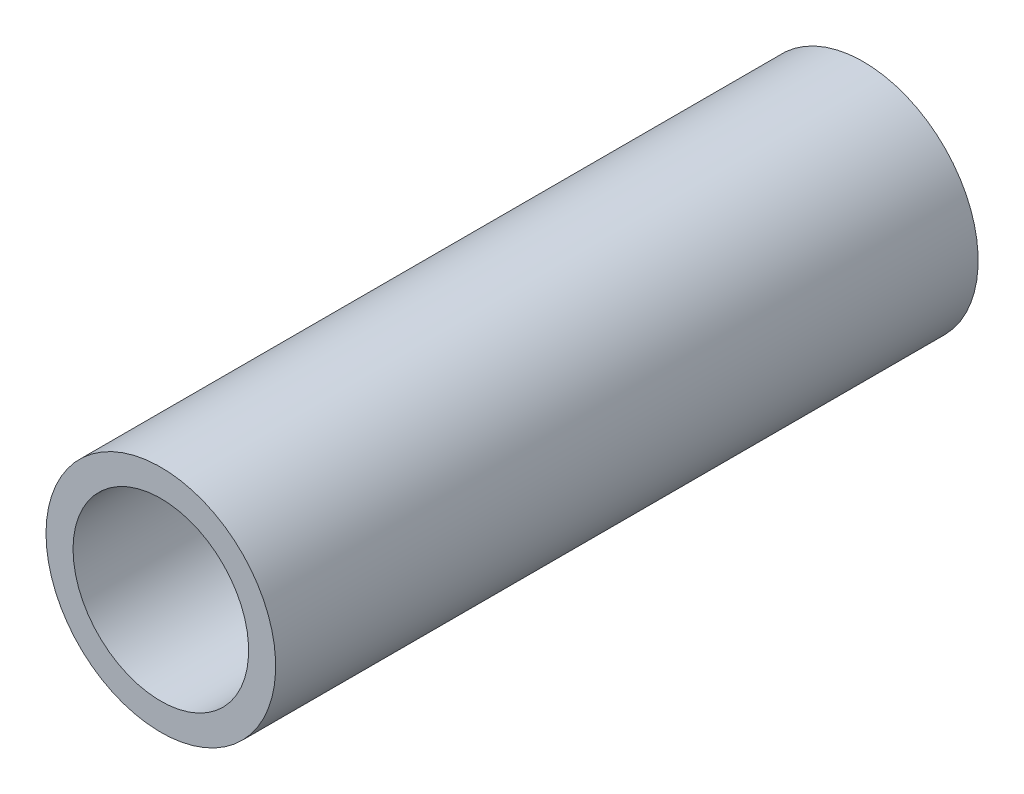
ISO-10303-21;
HEADER;
FILE_DESCRIPTION(('STEP AP214'),'2;1');
FILE_NAME('part.step','',(''),(''),'','','');
FILE_SCHEMA(('AUTOMOTIVE_DESIGN { 1 0 10303 214 1 1 1 1 }'));
ENDSEC;
DATA;
#1=APPLICATION_CONTEXT('core data for automotive mechanical design processes');
#2=APPLICATION_PROTOCOL_DEFINITION('international standard','automotive_design',2000,#1);
#3=PRODUCT_CONTEXT('',#1,'mechanical');
#4=PRODUCT('Part','Part','',(#3));
#5=PRODUCT_RELATED_PRODUCT_CATEGORY('part','',(#4));
#6=PRODUCT_DEFINITION_FORMATION('','',#4);
#7=PRODUCT_DEFINITION_CONTEXT('part definition',#1,'design');
#8=PRODUCT_DEFINITION('design','',#6,#7);
#9=PRODUCT_DEFINITION_SHAPE('','',#8);
#10=(LENGTH_UNIT() NAMED_UNIT(*) SI_UNIT(.MILLI.,.METRE.));
#11=(NAMED_UNIT(*) PLANE_ANGLE_UNIT() SI_UNIT($,.RADIAN.));
#12=(NAMED_UNIT(*) SI_UNIT($,.STERADIAN.) SOLID_ANGLE_UNIT());
#13=UNCERTAINTY_MEASURE_WITH_UNIT(LENGTH_MEASURE(1.E-05),#10,'distance_accuracy_value','');
#14=(GEOMETRIC_REPRESENTATION_CONTEXT(3) GLOBAL_UNCERTAINTY_ASSIGNED_CONTEXT((#13)) GLOBAL_UNIT_ASSIGNED_CONTEXT((#10,
#11,#12)) REPRESENTATION_CONTEXT('',''));
#15=CARTESIAN_POINT('',(0.,0.,0.));
#16=DIRECTION('',(0.,0.,1.));
#17=DIRECTION('',(1.,0.,0.));
#18=AXIS2_PLACEMENT_3D('',#15,#16,#17);
#19=CARTESIAN_POINT('',(0.,0.,26.));
#20=DIRECTION('',(0.,0.,1.));
#21=DIRECTION('',(1.,0.,0.));
#22=AXIS2_PLACEMENT_3D('',#19,#20,#21);
#23=PLANE('',#22);
#24=CARTESIAN_POINT('',(0.,0.,26.));
#25=DIRECTION('',(0.,0.,1.));
#26=DIRECTION('',(1.,0.,0.));
#27=AXIS2_PLACEMENT_3D('',#24,#25,#26);
#28=CIRCLE('',#27,4.25);
#29=CARTESIAN_POINT('',(-4.25,0.,26.));
#30=VERTEX_POINT('',#29);
#31=EDGE_CURVE('E10',#30,#30,#28,.T.);
#32=ORIENTED_EDGE('',*,*,#31,.T.);
#33=EDGE_LOOP('',(#32));
#34=FACE_BOUND('',#33,.T.);
#35=CARTESIAN_POINT('',(0.,0.,26.));
#36=DIRECTION('',(0.,0.,1.));
#37=DIRECTION('',(1.,0.,0.));
#38=AXIS2_PLACEMENT_3D('',#35,#36,#37);
#39=CIRCLE('',#38,3.25);
#40=CARTESIAN_POINT('',(-3.25,0.,26.));
#41=VERTEX_POINT('',#40);
#42=EDGE_CURVE('E42',#41,#41,#39,.T.);
#43=ORIENTED_EDGE('',*,*,#42,.F.);
#44=EDGE_LOOP('',(#43));
#45=FACE_BOUND('',#44,.T.);
#46=ADVANCED_FACE('F31',(#34,#45),#23,.T.);
#47=CARTESIAN_POINT('',(0.,0.,0.));
#48=DIRECTION('',(0.,0.,1.));
#49=DIRECTION('',(1.,0.,0.));
#50=AXIS2_PLACEMENT_3D('',#47,#48,#49);
#51=PLANE('',#50);
#52=CARTESIAN_POINT('',(0.,0.,0.));
#53=DIRECTION('',(0.,0.,1.));
#54=DIRECTION('',(1.,0.,0.));
#55=AXIS2_PLACEMENT_3D('',#52,#53,#54);
#56=CIRCLE('',#55,4.25);
#57=CARTESIAN_POINT('',(-4.25,0.,0.));
#58=VERTEX_POINT('',#57);
#59=EDGE_CURVE('E35',#58,#58,#56,.T.);
#60=ORIENTED_EDGE('',*,*,#59,.F.);
#61=EDGE_LOOP('',(#60));
#62=FACE_BOUND('',#61,.T.);
#63=CARTESIAN_POINT('',(0.,0.,0.));
#64=DIRECTION('',(0.,0.,1.));
#65=DIRECTION('',(1.,0.,0.));
#66=AXIS2_PLACEMENT_3D('',#63,#64,#65);
#67=CIRCLE('',#66,3.25);
#68=CARTESIAN_POINT('',(-3.25,0.,0.));
#69=VERTEX_POINT('',#68);
#70=EDGE_CURVE('E44',#69,#69,#67,.T.);
#71=ORIENTED_EDGE('',*,*,#70,.T.);
#72=EDGE_LOOP('',(#71));
#73=FACE_BOUND('',#72,.T.);
#74=ADVANCED_FACE('F54',(#62,#73),#51,.F.);
#75=CARTESIAN_POINT('',(0.,0.,26.));
#76=DIRECTION('',(0.,0.,-1.));
#77=DIRECTION('',(-1.,0.,0.));
#78=AXIS2_PLACEMENT_3D('',#75,#76,#77);
#79=CYLINDRICAL_SURFACE('',#78,4.25);
#80=CARTESIAN_POINT('',(-4.25,0.,26.));
#81=CARTESIAN_POINT('',(-4.25,0.,25.7291666666667));
#82=CARTESIAN_POINT('',(-4.25,0.,25.4583333333333));
#83=CARTESIAN_POINT('',(-4.25,0.,24.9166666666667));
#84=CARTESIAN_POINT('',(-4.25,0.,24.6458333333333));
#85=CARTESIAN_POINT('',(-4.25,0.,24.1041666666667));
#86=CARTESIAN_POINT('',(-4.25,0.,23.8333333333333));
#87=CARTESIAN_POINT('',(-4.25,0.,23.2916666666667));
#88=CARTESIAN_POINT('',(-4.25,0.,23.0208333333333));
#89=CARTESIAN_POINT('',(-4.25,0.,22.4791666666667));
#90=CARTESIAN_POINT('',(-4.25,0.,22.2083333333333));
#91=CARTESIAN_POINT('',(-4.25,0.,21.6666666666667));
#92=CARTESIAN_POINT('',(-4.25,0.,21.3958333333333));
#93=CARTESIAN_POINT('',(-4.25,0.,20.8541666666667));
#94=CARTESIAN_POINT('',(-4.25,0.,20.5833333333333));
#95=CARTESIAN_POINT('',(-4.25,0.,20.0416666666667));
#96=CARTESIAN_POINT('',(-4.25,0.,19.7708333333333));
#97=CARTESIAN_POINT('',(-4.25,0.,19.2291666666667));
#98=CARTESIAN_POINT('',(-4.25,0.,18.9583333333333));
#99=CARTESIAN_POINT('',(-4.25,0.,18.4166666666667));
#100=CARTESIAN_POINT('',(-4.25,0.,18.1458333333333));
#101=CARTESIAN_POINT('',(-4.25,0.,17.6041666666667));
#102=CARTESIAN_POINT('',(-4.25,0.,17.3333333333333));
#103=CARTESIAN_POINT('',(-4.25,0.,16.7916666666667));
#104=CARTESIAN_POINT('',(-4.25,0.,16.5208333333333));
#105=CARTESIAN_POINT('',(-4.25,0.,15.9791666666667));
#106=CARTESIAN_POINT('',(-4.25,0.,15.7083333333333));
#107=CARTESIAN_POINT('',(-4.25,0.,15.1666666666667));
#108=CARTESIAN_POINT('',(-4.25,0.,14.8958333333333));
#109=CARTESIAN_POINT('',(-4.25,0.,14.3541666666667));
#110=CARTESIAN_POINT('',(-4.25,0.,14.0833333333333));
#111=CARTESIAN_POINT('',(-4.25,0.,13.5416666666667));
#112=CARTESIAN_POINT('',(-4.25,0.,13.2708333333333));
#113=CARTESIAN_POINT('',(-4.25,0.,12.7291666666667));
#114=CARTESIAN_POINT('',(-4.25,0.,12.4583333333333));
#115=CARTESIAN_POINT('',(-4.25,0.,11.9166666666667));
#116=CARTESIAN_POINT('',(-4.25,0.,11.6458333333333));
#117=CARTESIAN_POINT('',(-4.25,0.,11.1041666666667));
#118=CARTESIAN_POINT('',(-4.25,0.,10.8333333333333));
#119=CARTESIAN_POINT('',(-4.25,0.,10.2916666666667));
#120=CARTESIAN_POINT('',(-4.25,0.,10.0208333333333));
#121=CARTESIAN_POINT('',(-4.25,0.,9.47916666666667));
#122=CARTESIAN_POINT('',(-4.25,0.,9.20833333333333));
#123=CARTESIAN_POINT('',(-4.25,0.,8.66666666666667));
#124=CARTESIAN_POINT('',(-4.25,0.,8.39583333333333));
#125=CARTESIAN_POINT('',(-4.25,0.,7.85416666666667));
#126=CARTESIAN_POINT('',(-4.25,0.,7.58333333333333));
#127=CARTESIAN_POINT('',(-4.25,0.,7.04166666666667));
#128=CARTESIAN_POINT('',(-4.25,0.,6.77083333333333));
#129=CARTESIAN_POINT('',(-4.25,0.,6.22916666666667));
#130=CARTESIAN_POINT('',(-4.25,0.,5.95833333333333));
#131=CARTESIAN_POINT('',(-4.25,0.,5.41666666666667));
#132=CARTESIAN_POINT('',(-4.25,0.,5.14583333333333));
#133=CARTESIAN_POINT('',(-4.25,0.,4.60416666666667));
#134=CARTESIAN_POINT('',(-4.25,0.,4.33333333333333));
#135=CARTESIAN_POINT('',(-4.25,0.,3.79166666666667));
#136=CARTESIAN_POINT('',(-4.25,0.,3.52083333333333));
#137=CARTESIAN_POINT('',(-4.25,0.,2.97916666666667));
#138=CARTESIAN_POINT('',(-4.25,0.,2.70833333333333));
#139=CARTESIAN_POINT('',(-4.25,0.,2.16666666666667));
#140=CARTESIAN_POINT('',(-4.25,0.,1.89583333333333));
#141=CARTESIAN_POINT('',(-4.25,0.,1.35416666666667));
#142=CARTESIAN_POINT('',(-4.25,0.,1.08333333333333));
#143=CARTESIAN_POINT('',(-4.25,0.,0.541666666666667));
#144=CARTESIAN_POINT('',(-4.25,0.,0.270833333333334));
#145=CARTESIAN_POINT('',(-4.25,0.,0.));
#146=B_SPLINE_CURVE_WITH_KNOTS('',3,(#80,#81,#82,#83,#84,#85,#86,#87,#88,#89,#90,#91,#92,#93,
#94,#95,#96,#97,#98,#99,#100,#101,#102,#103,#104,#105,#106,#107,#108,#109,#110,#111,#112,#113,
#114,#115,#116,#117,#118,#119,#120,#121,#122,#123,#124,#125,#126,#127,#128,#129,#130,#131,#132,
#133,#134,#135,#136,#137,#138,#139,#140,#141,#142,#143,#144,#145),.UNSPECIFIED.,.F.,.F.,(4,2,2,
2,2,2,2,2,2,2,2,2,2,2,2,2,2,2,2,2,2,2,2,2,2,2,2,2,2,2,2,2,4),(0.,0.812499999999997,1.625,2.4375,
3.25,4.0625,4.875,5.6875,6.5,7.3125,8.125,8.93749999999999,9.74999999999999,10.5625,11.375,
12.1875,13.,13.8125,14.625,15.4375,16.25,17.0625,17.875,18.6875,19.5,20.3125,21.125,21.9375,
22.75,23.5625,24.375,25.1875,26.),.UNSPECIFIED.);
#147=EDGE_CURVE('BSEAM33',#30,#58,#146,.T.);
#148=ORIENTED_EDGE('',*,*,#31,.F.);
#149=ORIENTED_EDGE('',*,*,#59,.T.);
#150=ORIENTED_EDGE('',*,*,#147,.T.);
#151=ORIENTED_EDGE('',*,*,#147,.F.);
#152=EDGE_LOOP('',(#148,#150,#149,#151));
#153=FACE_BOUND('',#152,.T.);
#154=ADVANCED_FACE('F33',(#153),#79,.T.);
#155=CARTESIAN_POINT('',(0.,0.,26.));
#156=DIRECTION('',(0.,0.,-1.));
#157=DIRECTION('',(-1.,0.,0.));
#158=AXIS2_PLACEMENT_3D('',#155,#156,#157);
#159=CYLINDRICAL_SURFACE('',#158,3.25);
#160=CARTESIAN_POINT('',(-3.25,0.,26.));
#161=CARTESIAN_POINT('',(-3.25,0.,25.7291666666667));
#162=CARTESIAN_POINT('',(-3.25,0.,25.4583333333333));
#163=CARTESIAN_POINT('',(-3.25,0.,24.9166666666667));
#164=CARTESIAN_POINT('',(-3.25,0.,24.6458333333333));
#165=CARTESIAN_POINT('',(-3.25,0.,24.1041666666667));
#166=CARTESIAN_POINT('',(-3.25,0.,23.8333333333333));
#167=CARTESIAN_POINT('',(-3.25,0.,23.2916666666667));
#168=CARTESIAN_POINT('',(-3.25,0.,23.0208333333333));
#169=CARTESIAN_POINT('',(-3.25,0.,22.4791666666667));
#170=CARTESIAN_POINT('',(-3.25,0.,22.2083333333333));
#171=CARTESIAN_POINT('',(-3.25,0.,21.6666666666667));
#172=CARTESIAN_POINT('',(-3.25,0.,21.3958333333333));
#173=CARTESIAN_POINT('',(-3.25,0.,20.8541666666667));
#174=CARTESIAN_POINT('',(-3.25,0.,20.5833333333333));
#175=CARTESIAN_POINT('',(-3.25,0.,20.0416666666667));
#176=CARTESIAN_POINT('',(-3.25,0.,19.7708333333333));
#177=CARTESIAN_POINT('',(-3.25,0.,19.2291666666667));
#178=CARTESIAN_POINT('',(-3.25,0.,18.9583333333333));
#179=CARTESIAN_POINT('',(-3.25,0.,18.4166666666667));
#180=CARTESIAN_POINT('',(-3.25,0.,18.1458333333333));
#181=CARTESIAN_POINT('',(-3.25,0.,17.6041666666667));
#182=CARTESIAN_POINT('',(-3.25,0.,17.3333333333333));
#183=CARTESIAN_POINT('',(-3.25,0.,16.7916666666667));
#184=CARTESIAN_POINT('',(-3.25,0.,16.5208333333333));
#185=CARTESIAN_POINT('',(-3.25,0.,15.9791666666667));
#186=CARTESIAN_POINT('',(-3.25,0.,15.7083333333333));
#187=CARTESIAN_POINT('',(-3.25,0.,15.1666666666667));
#188=CARTESIAN_POINT('',(-3.25,0.,14.8958333333333));
#189=CARTESIAN_POINT('',(-3.25,0.,14.3541666666667));
#190=CARTESIAN_POINT('',(-3.25,0.,14.0833333333333));
#191=CARTESIAN_POINT('',(-3.25,0.,13.5416666666667));
#192=CARTESIAN_POINT('',(-3.25,0.,13.2708333333333));
#193=CARTESIAN_POINT('',(-3.25,0.,12.7291666666667));
#194=CARTESIAN_POINT('',(-3.25,0.,12.4583333333333));
#195=CARTESIAN_POINT('',(-3.25,0.,11.9166666666667));
#196=CARTESIAN_POINT('',(-3.25,0.,11.6458333333333));
#197=CARTESIAN_POINT('',(-3.25,0.,11.1041666666667));
#198=CARTESIAN_POINT('',(-3.25,0.,10.8333333333333));
#199=CARTESIAN_POINT('',(-3.25,0.,10.2916666666667));
#200=CARTESIAN_POINT('',(-3.25,0.,10.0208333333333));
#201=CARTESIAN_POINT('',(-3.25,0.,9.47916666666667));
#202=CARTESIAN_POINT('',(-3.25,0.,9.20833333333333));
#203=CARTESIAN_POINT('',(-3.25,0.,8.66666666666667));
#204=CARTESIAN_POINT('',(-3.25,0.,8.39583333333333));
#205=CARTESIAN_POINT('',(-3.25,0.,7.85416666666667));
#206=CARTESIAN_POINT('',(-3.25,0.,7.58333333333333));
#207=CARTESIAN_POINT('',(-3.25,0.,7.04166666666667));
#208=CARTESIAN_POINT('',(-3.25,0.,6.77083333333333));
#209=CARTESIAN_POINT('',(-3.25,0.,6.22916666666667));
#210=CARTESIAN_POINT('',(-3.25,0.,5.95833333333333));
#211=CARTESIAN_POINT('',(-3.25,0.,5.41666666666667));
#212=CARTESIAN_POINT('',(-3.25,0.,5.14583333333333));
#213=CARTESIAN_POINT('',(-3.25,0.,4.60416666666667));
#214=CARTESIAN_POINT('',(-3.25,0.,4.33333333333333));
#215=CARTESIAN_POINT('',(-3.25,0.,3.79166666666667));
#216=CARTESIAN_POINT('',(-3.25,0.,3.52083333333333));
#217=CARTESIAN_POINT('',(-3.25,0.,2.97916666666667));
#218=CARTESIAN_POINT('',(-3.25,0.,2.70833333333333));
#219=CARTESIAN_POINT('',(-3.25,0.,2.16666666666667));
#220=CARTESIAN_POINT('',(-3.25,0.,1.89583333333333));
#221=CARTESIAN_POINT('',(-3.25,0.,1.35416666666667));
#222=CARTESIAN_POINT('',(-3.25,0.,1.08333333333333));
#223=CARTESIAN_POINT('',(-3.25,0.,0.541666666666667));
#224=CARTESIAN_POINT('',(-3.25,0.,0.270833333333334));
#225=CARTESIAN_POINT('',(-3.25,0.,0.));
#226=B_SPLINE_CURVE_WITH_KNOTS('',3,(#160,#161,#162,#163,#164,#165,#166,#167,#168,#169,#170,
#171,#172,#173,#174,#175,#176,#177,#178,#179,#180,#181,#182,#183,#184,#185,#186,#187,#188,#189,
#190,#191,#192,#193,#194,#195,#196,#197,#198,#199,#200,#201,#202,#203,#204,#205,#206,#207,#208,
#209,#210,#211,#212,#213,#214,#215,#216,#217,#218,#219,#220,#221,#222,#223,#224,#225),
.UNSPECIFIED.,.F.,.F.,(4,2,2,2,2,2,2,2,2,2,2,2,2,2,2,2,2,2,2,2,2,2,2,2,2,2,2,2,2,2,2,2,4),(0.,
0.812499999999997,1.625,2.4375,3.25,4.0625,4.875,5.6875,6.5,7.3125,8.125,8.93749999999999,
9.74999999999999,10.5625,11.375,12.1875,13.,13.8125,14.625,15.4375,16.25,17.0625,17.875,18.6875,
19.5,20.3125,21.125,21.9375,22.75,23.5625,24.375,25.1875,26.),.UNSPECIFIED.);
#227=EDGE_CURVE('BSEAM50',#41,#69,#226,.T.);
#228=ORIENTED_EDGE('',*,*,#42,.T.);
#229=ORIENTED_EDGE('',*,*,#70,.F.);
#230=ORIENTED_EDGE('',*,*,#227,.T.);
#231=ORIENTED_EDGE('',*,*,#227,.F.);
#232=EDGE_LOOP('',(#228,#230,#229,#231));
#233=FACE_BOUND('',#232,.T.);
#234=ADVANCED_FACE('F50',(#233),#159,.F.);
#235=CLOSED_SHELL('',(#46,#74,#154,#234));
#236=MANIFOLD_SOLID_BREP('B2',#235);
#237=ADVANCED_BREP_SHAPE_REPRESENTATION('',(#18,#236),#14);
#238=SHAPE_DEFINITION_REPRESENTATION(#9,#237);
ENDSEC;
END-ISO-10303-21;
